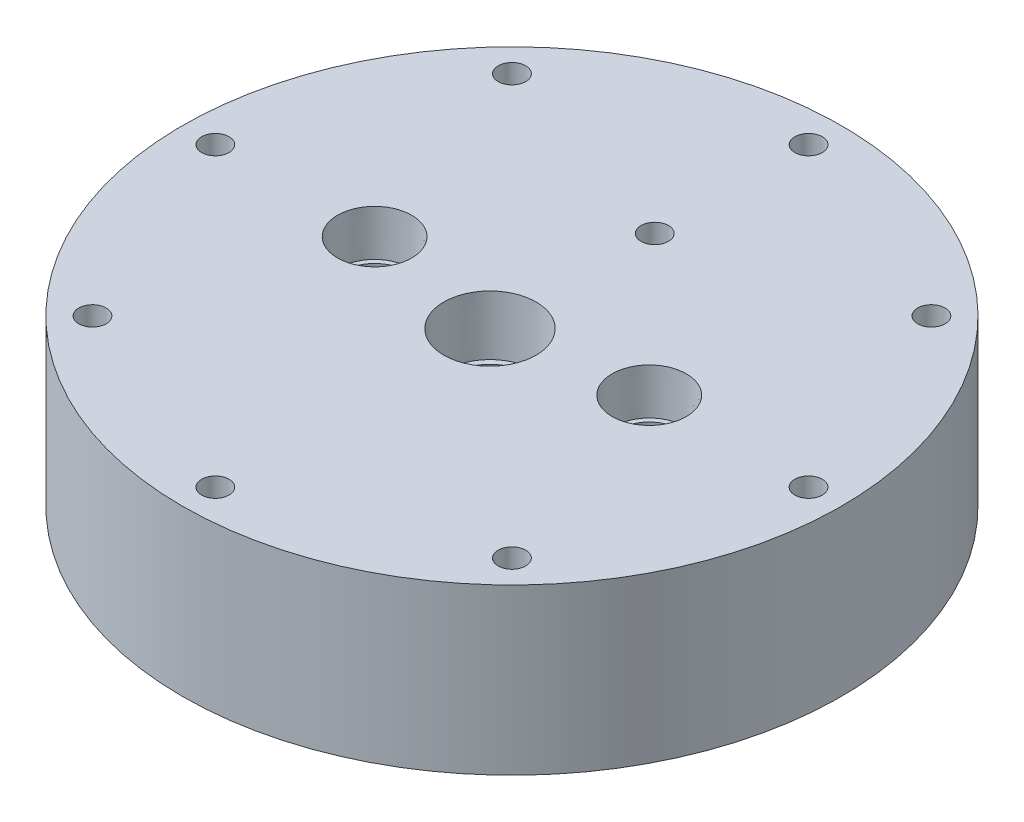
ISO-10303-21;
HEADER;
FILE_DESCRIPTION(('STEP AP214'),'2;1');
FILE_NAME('part.step','',(''),(''),'','','');
FILE_SCHEMA(('AUTOMOTIVE_DESIGN { 1 0 10303 214 1 1 1 1 }'));
ENDSEC;
DATA;
#1=APPLICATION_CONTEXT('core data for automotive mechanical design processes');
#2=APPLICATION_PROTOCOL_DEFINITION('international standard','automotive_design',2000,#1);
#3=PRODUCT_CONTEXT('',#1,'mechanical');
#4=PRODUCT('Part','Part','',(#3));
#5=PRODUCT_RELATED_PRODUCT_CATEGORY('part','',(#4));
#6=PRODUCT_DEFINITION_FORMATION('','',#4);
#7=PRODUCT_DEFINITION_CONTEXT('part definition',#1,'design');
#8=PRODUCT_DEFINITION('design','',#6,#7);
#9=PRODUCT_DEFINITION_SHAPE('','',#8);
#10=(LENGTH_UNIT() NAMED_UNIT(*) SI_UNIT(.MILLI.,.METRE.));
#11=(NAMED_UNIT(*) PLANE_ANGLE_UNIT() SI_UNIT($,.RADIAN.));
#12=(NAMED_UNIT(*) SI_UNIT($,.STERADIAN.) SOLID_ANGLE_UNIT());
#13=UNCERTAINTY_MEASURE_WITH_UNIT(LENGTH_MEASURE(1.E-05),#10,'distance_accuracy_value','');
#14=(GEOMETRIC_REPRESENTATION_CONTEXT(3) GLOBAL_UNCERTAINTY_ASSIGNED_CONTEXT((#13)) GLOBAL_UNIT_ASSIGNED_CONTEXT((#10,
#11,#12)) REPRESENTATION_CONTEXT('',''));
#15=CARTESIAN_POINT('',(0.,0.,0.));
#16=DIRECTION('',(0.,0.,1.));
#17=DIRECTION('',(1.,0.,0.));
#18=AXIS2_PLACEMENT_3D('',#15,#16,#17);
#19=CARTESIAN_POINT('',(0.,-40.64,0.));
#20=DIRECTION('',(0.,1.,0.));
#21=DIRECTION('',(0.,0.,1.));
#22=AXIS2_PLACEMENT_3D('',#19,#20,#21);
#23=PLANE('',#22);
#24=CARTESIAN_POINT('',(0.,-40.64,-33.02));
#25=DIRECTION('',(0.,1.,0.));
#26=DIRECTION('',(0.,0.,1.));
#27=AXIS2_PLACEMENT_3D('',#24,#25,#26);
#28=CIRCLE('',#27,3.175);
#29=CARTESIAN_POINT('',(0.,-40.64,-29.845));
#30=VERTEX_POINT('',#29);
#31=EDGE_CURVE('E564',#30,#30,#28,.F.);
#32=ORIENTED_EDGE('',*,*,#31,.F.);
#33=EDGE_LOOP('',(#32));
#34=FACE_BOUND('',#33,.T.);
#35=CARTESIAN_POINT('',(0.,-40.64,-33.02));
#36=DIRECTION('',(0.,1.,0.));
#37=DIRECTION('',(0.,0.,1.));
#38=AXIS2_PLACEMENT_3D('',#35,#36,#37);
#39=CIRCLE('',#38,7.62);
#40=CARTESIAN_POINT('',(0.,-40.64,-25.4));
#41=VERTEX_POINT('',#40);
#42=EDGE_CURVE('E553',#41,#41,#39,.T.);
#43=ORIENTED_EDGE('',*,*,#42,.F.);
#44=EDGE_LOOP('',(#43));
#45=FACE_BOUND('',#44,.T.);
#46=ADVANCED_FACE('F33',(#34,#45),#23,.F.);
#47=CARTESIAN_POINT('',(0.,-36.83,5.08));
#48=DIRECTION('',(0.,1.,0.));
#49=DIRECTION('',(0.,0.,1.));
#50=AXIS2_PLACEMENT_3D('',#47,#48,#49);
#51=PLANE('',#50);
#52=CARTESIAN_POINT('',(0.,-36.83,5.08));
#53=DIRECTION('',(0.,1.,0.));
#54=DIRECTION('',(0.,0.,1.));
#55=AXIS2_PLACEMENT_3D('',#52,#53,#54);
#56=CIRCLE('',#55,13.97);
#57=CARTESIAN_POINT('',(0.,-36.83,19.05));
#58=VERTEX_POINT('',#57);
#59=EDGE_CURVE('E46',#58,#58,#56,.F.);
#60=ORIENTED_EDGE('',*,*,#59,.F.);
#61=EDGE_LOOP('',(#60));
#62=FACE_BOUND('',#61,.T.);
#63=CARTESIAN_POINT('',(0.,-36.83,5.08));
#64=DIRECTION('',(0.,-1.,0.));
#65=DIRECTION('',(0.,0.,-1.));
#66=AXIS2_PLACEMENT_3D('',#63,#64,#65);
#67=CIRCLE('',#66,16.51);
#68=CARTESIAN_POINT('',(0.,-36.83,-11.43));
#69=VERTEX_POINT('',#68);
#70=EDGE_CURVE('E64',#69,#69,#67,.T.);
#71=ORIENTED_EDGE('',*,*,#70,.T.);
#72=EDGE_LOOP('',(#71));
#73=FACE_BOUND('',#72,.T.);
#74=ADVANCED_FACE('F172',(#62,#73),#51,.F.);
#75=CARTESIAN_POINT('',(0.,-36.83,5.08));
#76=DIRECTION('',(0.,-1.,0.));
#77=DIRECTION('',(0.,0.,-1.));
#78=AXIS2_PLACEMENT_3D('',#75,#76,#77);
#79=CYLINDRICAL_SURFACE('',#78,19.05);
#80=CARTESIAN_POINT('',(0.,-40.64,5.08));
#81=DIRECTION('',(0.,1.,0.));
#82=DIRECTION('',(0.,0.,1.));
#83=AXIS2_PLACEMENT_3D('',#80,#81,#82);
#84=CIRCLE('',#83,19.05);
#85=CARTESIAN_POINT('',(0.,-40.64,24.13));
#86=VERTEX_POINT('',#85);
#87=EDGE_CURVE('E53',#86,#86,#84,.T.);
#88=ORIENTED_EDGE('',*,*,#87,.F.);
#89=EDGE_LOOP('',(#88));
#90=FACE_BOUND('',#89,.T.);
#91=CARTESIAN_POINT('',(0.,-36.83,5.08));
#92=DIRECTION('',(0.,1.,0.));
#93=DIRECTION('',(0.,0.,1.));
#94=AXIS2_PLACEMENT_3D('',#91,#92,#93);
#95=CIRCLE('',#94,19.05);
#96=CARTESIAN_POINT('',(0.,-36.83,24.13));
#97=VERTEX_POINT('',#96);
#98=EDGE_CURVE('E41',#97,#97,#95,.T.);
#99=ORIENTED_EDGE('',*,*,#98,.T.);
#100=EDGE_LOOP('',(#99));
#101=FACE_BOUND('',#100,.T.);
#102=ADVANCED_FACE('F178',(#90,#101),#79,.F.);
#103=CARTESIAN_POINT('',(0.,-36.83,5.08));
#104=DIRECTION('',(0.,-1.,0.));
#105=DIRECTION('',(0.,0.,-1.));
#106=AXIS2_PLACEMENT_3D('',#103,#104,#105);
#107=CIRCLE('',#106,17.78);
#108=CARTESIAN_POINT('',(0.,-36.83,-12.7));
#109=VERTEX_POINT('',#108);
#110=EDGE_CURVE('E82',#109,#109,#107,.T.);
#111=ORIENTED_EDGE('',*,*,#110,.F.);
#112=EDGE_LOOP('',(#111));
#113=FACE_BOUND('',#112,.T.);
#114=ORIENTED_EDGE('',*,*,#98,.F.);
#115=EDGE_LOOP('',(#114));
#116=FACE_BOUND('',#115,.T.);
#117=ADVANCED_FACE('F168',(#113,#116),#51,.F.);
#118=CARTESIAN_POINT('',(0.,-30.48,5.08));
#119=DIRECTION('',(0.,-1.,0.));
#120=DIRECTION('',(0.,0.,-1.));
#121=AXIS2_PLACEMENT_3D('',#118,#119,#120);
#122=CYLINDRICAL_SURFACE('',#121,13.97);
#123=CARTESIAN_POINT('',(0.,-30.48,5.08));
#124=DIRECTION('',(0.,1.,0.));
#125=DIRECTION('',(0.,0.,1.));
#126=AXIS2_PLACEMENT_3D('',#123,#124,#125);
#127=CIRCLE('',#126,13.97);
#128=CARTESIAN_POINT('',(0.,-30.48,19.05));
#129=VERTEX_POINT('',#128);
#130=EDGE_CURVE('E52',#129,#129,#127,.T.);
#131=ORIENTED_EDGE('',*,*,#130,.T.);
#132=EDGE_LOOP('',(#131));
#133=FACE_BOUND('',#132,.T.);
#134=ORIENTED_EDGE('',*,*,#59,.T.);
#135=EDGE_LOOP('',(#134));
#136=FACE_BOUND('',#135,.T.);
#137=ADVANCED_FACE('F153',(#133,#136),#122,.F.);
#138=CARTESIAN_POINT('',(0.,-30.48,5.08));
#139=DIRECTION('',(0.,1.,0.));
#140=DIRECTION('',(0.,0.,1.));
#141=AXIS2_PLACEMENT_3D('',#138,#139,#140);
#142=PLANE('',#141);
#143=CARTESIAN_POINT('',(0.,-30.48,5.08));
#144=DIRECTION('',(0.,1.,0.));
#145=DIRECTION('',(0.,0.,1.));
#146=AXIS2_PLACEMENT_3D('',#143,#144,#145);
#147=CIRCLE('',#146,8.9281);
#148=CARTESIAN_POINT('',(0.,-30.48,14.0081));
#149=VERTEX_POINT('',#148);
#150=EDGE_CURVE('E58',#149,#149,#147,.T.);
#151=ORIENTED_EDGE('',*,*,#150,.T.);
#152=EDGE_LOOP('',(#151));
#153=FACE_BOUND('',#152,.T.);
#154=ORIENTED_EDGE('',*,*,#130,.F.);
#155=EDGE_LOOP('',(#154));
#156=FACE_BOUND('',#155,.T.);
#157=ADVANCED_FACE('F156',(#153,#156),#142,.F.);
#158=CARTESIAN_POINT('',(0.,-40.64,0.));
#159=DIRECTION('',(0.,-1.,0.));
#160=DIRECTION('',(0.,0.,-1.));
#161=AXIS2_PLACEMENT_3D('',#158,#159,#160);
#162=CYLINDRICAL_SURFACE('',#161,60.96);
#163=CARTESIAN_POINT('',(0.,-40.64,0.));
#164=DIRECTION('',(0.,1.,0.));
#165=DIRECTION('',(0.,0.,1.));
#166=AXIS2_PLACEMENT_3D('',#163,#164,#165);
#167=CIRCLE('',#166,60.96);
#168=CARTESIAN_POINT('',(0.,-40.64,60.96));
#169=VERTEX_POINT('',#168);
#170=EDGE_CURVE('E57',#169,#169,#167,.T.);
#171=ORIENTED_EDGE('',*,*,#170,.T.);
#172=EDGE_LOOP('',(#171));
#173=FACE_BOUND('',#172,.T.);
#174=CARTESIAN_POINT('',(0.,-50.8,0.));
#175=DIRECTION('',(0.,1.,0.));
#176=DIRECTION('',(0.,0.,1.));
#177=AXIS2_PLACEMENT_3D('',#174,#175,#176);
#178=CIRCLE('',#177,60.96);
#179=CARTESIAN_POINT('',(0.,-50.8,60.96));
#180=VERTEX_POINT('',#179);
#181=EDGE_CURVE('E60',#180,#180,#178,.T.);
#182=ORIENTED_EDGE('',*,*,#181,.F.);
#183=EDGE_LOOP('',(#182));
#184=FACE_BOUND('',#183,.T.);
#185=ADVANCED_FACE('F158',(#173,#184),#162,.F.);
#186=CARTESIAN_POINT('',(0.,-40.64,-33.02));
#187=DIRECTION('',(0.,1.,0.));
#188=DIRECTION('',(0.,0.,1.));
#189=AXIS2_PLACEMENT_3D('',#186,#187,#188);
#190=CIRCLE('',#189,8.89);
#191=CARTESIAN_POINT('',(0.,-40.64,-24.13));
#192=VERTEX_POINT('',#191);
#193=EDGE_CURVE('E194',#192,#192,#190,.T.);
#194=ORIENTED_EDGE('',*,*,#193,.T.);
#195=EDGE_LOOP('',(#194));
#196=FACE_BOUND('',#195,.T.);
#197=CARTESIAN_POINT('',(-31.75,-40.64,0.));
#198=DIRECTION('',(0.,1.,0.));
#199=DIRECTION('',(0.,0.,1.));
#200=AXIS2_PLACEMENT_3D('',#197,#198,#199);
#201=CIRCLE('',#200,7.1374);
#202=CARTESIAN_POINT('',(-31.75,-40.64,7.1374));
#203=VERTEX_POINT('',#202);
#204=EDGE_CURVE('E37',#203,#203,#201,.T.);
#205=ORIENTED_EDGE('',*,*,#204,.T.);
#206=EDGE_LOOP('',(#205));
#207=FACE_BOUND('',#206,.T.);
#208=CARTESIAN_POINT('',(31.75,-40.64,0.));
#209=DIRECTION('',(0.,1.,0.));
#210=DIRECTION('',(0.,0.,1.));
#211=AXIS2_PLACEMENT_3D('',#208,#209,#210);
#212=CIRCLE('',#211,7.1374);
#213=CARTESIAN_POINT('',(31.75,-40.64,7.1374));
#214=VERTEX_POINT('',#213);
#215=EDGE_CURVE('E62',#214,#214,#212,.T.);
#216=ORIENTED_EDGE('',*,*,#215,.T.);
#217=EDGE_LOOP('',(#216));
#218=FACE_BOUND('',#217,.T.);
#219=ORIENTED_EDGE('',*,*,#87,.T.);
#220=EDGE_LOOP('',(#219));
#221=FACE_BOUND('',#220,.T.);
#222=ORIENTED_EDGE('',*,*,#170,.F.);
#223=EDGE_LOOP('',(#222));
#224=FACE_BOUND('',#223,.T.);
#225=ADVANCED_FACE('F165',(#196,#207,#218,#221,#224),#23,.F.);
#226=CARTESIAN_POINT('',(0.,-12.7,0.));
#227=DIRECTION('',(0.,1.,0.));
#228=DIRECTION('',(0.,0.,1.));
#229=AXIS2_PLACEMENT_3D('',#226,#227,#228);
#230=PLANE('',#229);
#231=CARTESIAN_POINT('',(0.,-12.7,-33.02));
#232=DIRECTION('',(0.,1.,0.));
#233=DIRECTION('',(0.,0.,1.));
#234=AXIS2_PLACEMENT_3D('',#231,#232,#233);
#235=CIRCLE('',#234,3.175);
#236=CARTESIAN_POINT('',(0.,-12.7,-29.845));
#237=VERTEX_POINT('',#236);
#238=EDGE_CURVE('E560',#237,#237,#235,.F.);
#239=ORIENTED_EDGE('',*,*,#238,.T.);
#240=EDGE_LOOP('',(#239));
#241=FACE_BOUND('',#240,.T.);
#242=CARTESIAN_POINT('',(-31.75,-12.7,0.));
#243=DIRECTION('',(0.,1.,0.));
#244=DIRECTION('',(0.,0.,1.));
#245=AXIS2_PLACEMENT_3D('',#242,#243,#244);
#246=CIRCLE('',#245,8.5750146);
#247=CARTESIAN_POINT('',(-31.75,-12.7,8.5750146));
#248=VERTEX_POINT('',#247);
#249=EDGE_CURVE('E567',#248,#248,#246,.T.);
#250=ORIENTED_EDGE('',*,*,#249,.F.);
#251=EDGE_LOOP('',(#250));
#252=FACE_BOUND('',#251,.T.);
#253=CARTESIAN_POINT('',(31.75,-12.7,0.));
#254=DIRECTION('',(0.,1.,0.));
#255=DIRECTION('',(0.,0.,1.));
#256=AXIS2_PLACEMENT_3D('',#253,#254,#255);
#257=CIRCLE('',#256,8.5750146);
#258=CARTESIAN_POINT('',(31.75,-12.7,8.5750146));
#259=VERTEX_POINT('',#258);
#260=EDGE_CURVE('E77',#259,#259,#257,.T.);
#261=ORIENTED_EDGE('',*,*,#260,.F.);
#262=EDGE_LOOP('',(#261));
#263=FACE_BOUND('',#262,.T.);
#264=CARTESIAN_POINT('',(0.,-12.7,5.08));
#265=DIRECTION('',(0.,1.,0.));
#266=DIRECTION('',(0.,0.,1.));
#267=AXIS2_PLACEMENT_3D('',#264,#265,#266);
#268=CIRCLE('',#267,10.6647361);
#269=CARTESIAN_POINT('',(0.,-12.7,15.7447361));
#270=VERTEX_POINT('',#269);
#271=EDGE_CURVE('E87',#270,#270,#268,.T.);
#272=ORIENTED_EDGE('',*,*,#271,.F.);
#273=EDGE_LOOP('',(#272));
#274=FACE_BOUND('',#273,.T.);
#275=CARTESIAN_POINT('',(68.58,-12.7,2.41126874597481E-13));
#276=DIRECTION('',(0.,1.,0.));
#277=DIRECTION('',(0.,0.,1.));
#278=AXIS2_PLACEMENT_3D('',#275,#276,#277);
#279=CIRCLE('',#278,3.175);
#280=CARTESIAN_POINT('',(68.58,-12.7,3.17500000000024));
#281=VERTEX_POINT('',#280);
#282=EDGE_CURVE('E116',#281,#281,#279,.T.);
#283=ORIENTED_EDGE('',*,*,#282,.F.);
#284=EDGE_LOOP('',(#283));
#285=FACE_BOUND('',#284,.T.);
#286=CARTESIAN_POINT('',(48.4933830537732,-12.7,48.4933830537737));
#287=DIRECTION('',(0.,1.,0.));
#288=DIRECTION('',(0.,0.,1.));
#289=AXIS2_PLACEMENT_3D('',#286,#287,#288);
#290=CIRCLE('',#289,3.175);
#291=CARTESIAN_POINT('',(48.4933830537732,-12.7,51.6683830537737));
#292=VERTEX_POINT('',#291);
#293=EDGE_CURVE('E117',#292,#292,#290,.T.);
#294=ORIENTED_EDGE('',*,*,#293,.F.);
#295=EDGE_LOOP('',(#294));
#296=FACE_BOUND('',#295,.T.);
#297=CARTESIAN_POINT('',(0.,-12.7,68.58));
#298=DIRECTION('',(0.,1.,0.));
#299=DIRECTION('',(0.,0.,1.));
#300=AXIS2_PLACEMENT_3D('',#297,#298,#299);
#301=CIRCLE('',#300,3.175);
#302=CARTESIAN_POINT('',(0.,-12.7,71.755));
#303=VERTEX_POINT('',#302);
#304=EDGE_CURVE('E124',#303,#303,#301,.T.);
#305=ORIENTED_EDGE('',*,*,#304,.F.);
#306=EDGE_LOOP('',(#305));
#307=FACE_BOUND('',#306,.T.);
#308=CARTESIAN_POINT('',(-48.4933830537739,-12.7,48.493383053773));
#309=DIRECTION('',(0.,1.,0.));
#310=DIRECTION('',(0.,0.,1.));
#311=AXIS2_PLACEMENT_3D('',#308,#309,#310);
#312=CIRCLE('',#311,3.175);
#313=CARTESIAN_POINT('',(-48.4933830537739,-12.7,51.668383053773));
#314=VERTEX_POINT('',#313);
#315=EDGE_CURVE('E130',#314,#314,#312,.T.);
#316=ORIENTED_EDGE('',*,*,#315,.F.);
#317=EDGE_LOOP('',(#316));
#318=FACE_BOUND('',#317,.T.);
#319=CARTESIAN_POINT('',(-68.58,-12.7,-7.20018455033205E-13));
#320=DIRECTION('',(0.,1.,0.));
#321=DIRECTION('',(0.,0.,1.));
#322=AXIS2_PLACEMENT_3D('',#319,#320,#321);
#323=CIRCLE('',#322,3.175);
#324=CARTESIAN_POINT('',(-68.58,-12.7,3.17499999999928));
#325=VERTEX_POINT('',#324);
#326=EDGE_CURVE('E104',#325,#325,#323,.T.);
#327=ORIENTED_EDGE('',*,*,#326,.F.);
#328=EDGE_LOOP('',(#327));
#329=FACE_BOUND('',#328,.T.);
#330=CARTESIAN_POINT('',(-48.4933830537728,-12.7,-48.493383053774));
#331=DIRECTION('',(0.,1.,0.));
#332=DIRECTION('',(0.,0.,1.));
#333=AXIS2_PLACEMENT_3D('',#330,#331,#332);
#334=CIRCLE('',#333,3.175);
#335=CARTESIAN_POINT('',(-48.4933830537728,-12.7,-45.318383053774));
#336=VERTEX_POINT('',#335);
#337=EDGE_CURVE('E105',#336,#336,#334,.T.);
#338=ORIENTED_EDGE('',*,*,#337,.F.);
#339=EDGE_LOOP('',(#338));
#340=FACE_BOUND('',#339,.T.);
#341=CARTESIAN_POINT('',(48.4933830537735,-12.7,-48.4933830537733));
#342=DIRECTION('',(0.,1.,0.));
#343=DIRECTION('',(0.,0.,1.));
#344=AXIS2_PLACEMENT_3D('',#341,#342,#343);
#345=CIRCLE('',#344,3.175);
#346=CARTESIAN_POINT('',(48.4933830537735,-12.7,-45.3183830537734));
#347=VERTEX_POINT('',#346);
#348=EDGE_CURVE('E139',#347,#347,#345,.T.);
#349=ORIENTED_EDGE('',*,*,#348,.F.);
#350=EDGE_LOOP('',(#349));
#351=FACE_BOUND('',#350,.T.);
#352=CARTESIAN_POINT('',(0.,-12.7,-68.58));
#353=DIRECTION('',(0.,1.,0.));
#354=DIRECTION('',(0.,0.,1.));
#355=AXIS2_PLACEMENT_3D('',#352,#353,#354);
#356=CIRCLE('',#355,3.175);
#357=CARTESIAN_POINT('',(0.,-12.7,-65.405));
#358=VERTEX_POINT('',#357);
#359=EDGE_CURVE('E145',#358,#358,#356,.T.);
#360=ORIENTED_EDGE('',*,*,#359,.F.);
#361=EDGE_LOOP('',(#360));
#362=FACE_BOUND('',#361,.T.);
#363=CARTESIAN_POINT('',(0.,-12.7,0.));
#364=DIRECTION('',(0.,1.,0.));
#365=DIRECTION('',(0.,0.,1.));
#366=AXIS2_PLACEMENT_3D('',#363,#364,#365);
#367=CIRCLE('',#366,76.2);
#368=CARTESIAN_POINT('',(0.,-12.7,76.2));
#369=VERTEX_POINT('',#368);
#370=EDGE_CURVE('E148',#369,#369,#367,.T.);
#371=ORIENTED_EDGE('',*,*,#370,.T.);
#372=EDGE_LOOP('',(#371));
#373=FACE_BOUND('',#372,.T.);
#374=ADVANCED_FACE('F185',(#241,#252,#263,#274,#285,#296,#307,#318,#329,#340,#351,#362,#373),
#230,.T.);
#375=CARTESIAN_POINT('',(0.,-50.8,0.));
#376=DIRECTION('',(0.,1.,0.));
#377=DIRECTION('',(0.,0.,1.));
#378=AXIS2_PLACEMENT_3D('',#375,#376,#377);
#379=CYLINDRICAL_SURFACE('',#378,76.2);
#380=CARTESIAN_POINT('',(0.,-50.8,0.));
#381=DIRECTION('',(0.,1.,0.));
#382=DIRECTION('',(0.,0.,1.));
#383=AXIS2_PLACEMENT_3D('',#380,#381,#382);
#384=CIRCLE('',#383,76.2);
#385=CARTESIAN_POINT('',(0.,-50.8,76.2));
#386=VERTEX_POINT('',#385);
#387=EDGE_CURVE('E10',#386,#386,#384,.T.);
#388=ORIENTED_EDGE('',*,*,#387,.T.);
#389=EDGE_LOOP('',(#388));
#390=FACE_BOUND('',#389,.T.);
#391=ORIENTED_EDGE('',*,*,#370,.F.);
#392=EDGE_LOOP('',(#391));
#393=FACE_BOUND('',#392,.T.);
#394=ADVANCED_FACE('F35',(#390,#393),#379,.T.);
#395=CARTESIAN_POINT('',(0.,-12.699,-68.58));
#396=DIRECTION('',(0.,-1.,0.));
#397=DIRECTION('',(0.,0.,-1.));
#398=AXIS2_PLACEMENT_3D('',#395,#396,#397);
#399=CYLINDRICAL_SURFACE('',#398,3.175);
#400=ORIENTED_EDGE('',*,*,#359,.T.);
#401=EDGE_LOOP('',(#400));
#402=FACE_BOUND('',#401,.T.);
#403=CARTESIAN_POINT('',(0.,-50.8,-68.58));
#404=DIRECTION('',(0.,1.,0.));
#405=DIRECTION('',(0.,0.,1.));
#406=AXIS2_PLACEMENT_3D('',#403,#404,#405);
#407=CIRCLE('',#406,3.175);
#408=CARTESIAN_POINT('',(0.,-50.8,-65.405));
#409=VERTEX_POINT('',#408);
#410=EDGE_CURVE('E142',#409,#409,#407,.T.);
#411=ORIENTED_EDGE('',*,*,#410,.F.);
#412=EDGE_LOOP('',(#411));
#413=FACE_BOUND('',#412,.T.);
#414=ADVANCED_FACE('F226',(#402,#413),#399,.F.);
#415=CARTESIAN_POINT('',(48.4933830537735,-12.699,-48.4933830537733));
#416=DIRECTION('',(0.,-1.,0.));
#417=DIRECTION('',(0.,0.,-1.));
#418=AXIS2_PLACEMENT_3D('',#415,#416,#417);
#419=CYLINDRICAL_SURFACE('',#418,3.175);
#420=ORIENTED_EDGE('',*,*,#348,.T.);
#421=EDGE_LOOP('',(#420));
#422=FACE_BOUND('',#421,.T.);
#423=CARTESIAN_POINT('',(48.4933830537735,-50.8,-48.4933830537733));
#424=DIRECTION('',(0.,1.,0.));
#425=DIRECTION('',(-0.707106781186549,0.,0.707106781186546));
#426=AXIS2_PLACEMENT_3D('',#423,#424,#425);
#427=CIRCLE('',#426,3.175);
#428=CARTESIAN_POINT('',(46.2483190235062,-50.8,-46.2483190235061));
#429=VERTEX_POINT('',#428);
#430=EDGE_CURVE('E120',#429,#429,#427,.T.);
#431=ORIENTED_EDGE('',*,*,#430,.F.);
#432=EDGE_LOOP('',(#431));
#433=FACE_BOUND('',#432,.T.);
#434=ADVANCED_FACE('F228',(#422,#433),#419,.F.);
#435=CARTESIAN_POINT('',(-48.4933830537728,-12.699,-48.493383053774));
#436=DIRECTION('',(0.,-1.,0.));
#437=DIRECTION('',(0.,0.,-1.));
#438=AXIS2_PLACEMENT_3D('',#435,#436,#437);
#439=CYLINDRICAL_SURFACE('',#438,3.175);
#440=ORIENTED_EDGE('',*,*,#337,.T.);
#441=EDGE_LOOP('',(#440));
#442=FACE_BOUND('',#441,.T.);
#443=CARTESIAN_POINT('',(-48.4933830537728,-50.8,-48.493383053774));
#444=DIRECTION('',(0.,1.,0.));
#445=DIRECTION('',(0.707106781186539,0.,0.707106781186556));
#446=AXIS2_PLACEMENT_3D('',#443,#444,#445);
#447=CIRCLE('',#446,3.175);
#448=CARTESIAN_POINT('',(-46.2483190235056,-50.8,-46.2483190235067));
#449=VERTEX_POINT('',#448);
#450=EDGE_CURVE('E56',#449,#449,#447,.T.);
#451=ORIENTED_EDGE('',*,*,#450,.F.);
#452=EDGE_LOOP('',(#451));
#453=FACE_BOUND('',#452,.T.);
#454=ADVANCED_FACE('F235',(#442,#453),#439,.F.);
#455=CARTESIAN_POINT('',(-68.58,-12.699,-7.20018455033205E-13));
#456=DIRECTION('',(0.,-1.,0.));
#457=DIRECTION('',(0.,0.,-1.));
#458=AXIS2_PLACEMENT_3D('',#455,#456,#457);
#459=CYLINDRICAL_SURFACE('',#458,3.175);
#460=ORIENTED_EDGE('',*,*,#326,.T.);
#461=EDGE_LOOP('',(#460));
#462=FACE_BOUND('',#461,.T.);
#463=CARTESIAN_POINT('',(-68.58,-50.8,-7.20018455033205E-13));
#464=DIRECTION('',(0.,1.,0.));
#465=DIRECTION('',(1.,0.,0.));
#466=AXIS2_PLACEMENT_3D('',#463,#464,#465);
#467=CIRCLE('',#466,3.175);
#468=CARTESIAN_POINT('',(-65.405,-50.8,-6.86762095280724E-13));
#469=VERTEX_POINT('',#468);
#470=EDGE_CURVE('E101',#469,#469,#467,.T.);
#471=ORIENTED_EDGE('',*,*,#470,.F.);
#472=EDGE_LOOP('',(#471));
#473=FACE_BOUND('',#472,.T.);
#474=ADVANCED_FACE('F243',(#462,#473),#459,.F.);
#475=CARTESIAN_POINT('',(-48.4933830537739,-12.699,48.493383053773));
#476=DIRECTION('',(0.,-1.,0.));
#477=DIRECTION('',(0.,0.,-1.));
#478=AXIS2_PLACEMENT_3D('',#475,#476,#477);
#479=CYLINDRICAL_SURFACE('',#478,3.175);
#480=ORIENTED_EDGE('',*,*,#315,.T.);
#481=EDGE_LOOP('',(#480));
#482=FACE_BOUND('',#481,.T.);
#483=CARTESIAN_POINT('',(-48.4933830537739,-50.8,48.493383053773));
#484=DIRECTION('',(0.,1.,0.));
#485=DIRECTION('',(0.707106781186554,0.,-0.707106781186541));
#486=AXIS2_PLACEMENT_3D('',#483,#484,#485);
#487=CIRCLE('',#486,3.175);
#488=CARTESIAN_POINT('',(-46.2483190235065,-50.8,46.2483190235057));
#489=VERTEX_POINT('',#488);
#490=EDGE_CURVE('E108',#489,#489,#487,.T.);
#491=ORIENTED_EDGE('',*,*,#490,.F.);
#492=EDGE_LOOP('',(#491));
#493=FACE_BOUND('',#492,.T.);
#494=ADVANCED_FACE('F239',(#482,#493),#479,.F.);
#495=CARTESIAN_POINT('',(0.,-12.699,68.58));
#496=DIRECTION('',(0.,-1.,0.));
#497=DIRECTION('',(0.,0.,-1.));
#498=AXIS2_PLACEMENT_3D('',#495,#496,#497);
#499=CYLINDRICAL_SURFACE('',#498,3.175);
#500=ORIENTED_EDGE('',*,*,#304,.T.);
#501=EDGE_LOOP('',(#500));
#502=FACE_BOUND('',#501,.T.);
#503=CARTESIAN_POINT('',(0.,-50.8,68.58));
#504=DIRECTION('',(0.,1.,0.));
#505=DIRECTION('',(0.,0.,-1.));
#506=AXIS2_PLACEMENT_3D('',#503,#504,#505);
#507=CIRCLE('',#506,3.175);
#508=CARTESIAN_POINT('',(0.,-50.8,65.405));
#509=VERTEX_POINT('',#508);
#510=EDGE_CURVE('E127',#509,#509,#507,.T.);
#511=ORIENTED_EDGE('',*,*,#510,.F.);
#512=EDGE_LOOP('',(#511));
#513=FACE_BOUND('',#512,.T.);
#514=ADVANCED_FACE('F242',(#502,#513),#499,.F.);
#515=CARTESIAN_POINT('',(48.4933830537732,-12.699,48.4933830537737));
#516=DIRECTION('',(0.,-1.,0.));
#517=DIRECTION('',(0.,0.,-1.));
#518=AXIS2_PLACEMENT_3D('',#515,#516,#517);
#519=CYLINDRICAL_SURFACE('',#518,3.175);
#520=ORIENTED_EDGE('',*,*,#293,.T.);
#521=EDGE_LOOP('',(#520));
#522=FACE_BOUND('',#521,.T.);
#523=CARTESIAN_POINT('',(48.4933830537732,-50.8,48.4933830537737));
#524=DIRECTION('',(0.,1.,0.));
#525=DIRECTION('',(-0.707106781186544,0.,-0.707106781186551));
#526=AXIS2_PLACEMENT_3D('',#523,#524,#525);
#527=CIRCLE('',#526,3.175);
#528=CARTESIAN_POINT('',(46.2483190235059,-50.8,46.2483190235064));
#529=VERTEX_POINT('',#528);
#530=EDGE_CURVE('E121',#529,#529,#527,.T.);
#531=ORIENTED_EDGE('',*,*,#530,.F.);
#532=EDGE_LOOP('',(#531));
#533=FACE_BOUND('',#532,.T.);
#534=ADVANCED_FACE('F247',(#522,#533),#519,.F.);
#535=CARTESIAN_POINT('',(68.58,-12.699,2.41126874597481E-13));
#536=DIRECTION('',(0.,-1.,0.));
#537=DIRECTION('',(0.,0.,-1.));
#538=AXIS2_PLACEMENT_3D('',#535,#536,#537);
#539=CYLINDRICAL_SURFACE('',#538,3.175);
#540=ORIENTED_EDGE('',*,*,#282,.T.);
#541=EDGE_LOOP('',(#540));
#542=FACE_BOUND('',#541,.T.);
#543=CARTESIAN_POINT('',(68.58,-50.8,2.41126874597481E-13));
#544=DIRECTION('',(0.,1.,0.));
#545=DIRECTION('',(-1.,0.,0.));
#546=AXIS2_PLACEMENT_3D('',#543,#544,#545);
#547=CIRCLE('',#546,3.175);
#548=CARTESIAN_POINT('',(65.405,-50.8,2.30041421346654E-13));
#549=VERTEX_POINT('',#548);
#550=EDGE_CURVE('E113',#549,#549,#547,.T.);
#551=ORIENTED_EDGE('',*,*,#550,.F.);
#552=EDGE_LOOP('',(#551));
#553=FACE_BOUND('',#552,.T.);
#554=ADVANCED_FACE('F208',(#542,#553),#539,.F.);
#555=CARTESIAN_POINT('',(0.,-50.8,0.));
#556=DIRECTION('',(0.,1.,0.));
#557=DIRECTION('',(0.,0.,1.));
#558=AXIS2_PLACEMENT_3D('',#555,#556,#557);
#559=PLANE('',#558);
#560=ORIENTED_EDGE('',*,*,#181,.T.);
#561=EDGE_LOOP('',(#560));
#562=FACE_BOUND('',#561,.T.);
#563=ORIENTED_EDGE('',*,*,#550,.T.);
#564=EDGE_LOOP('',(#563));
#565=FACE_BOUND('',#564,.T.);
#566=ORIENTED_EDGE('',*,*,#530,.T.);
#567=EDGE_LOOP('',(#566));
#568=FACE_BOUND('',#567,.T.);
#569=ORIENTED_EDGE('',*,*,#510,.T.);
#570=EDGE_LOOP('',(#569));
#571=FACE_BOUND('',#570,.T.);
#572=ORIENTED_EDGE('',*,*,#490,.T.);
#573=EDGE_LOOP('',(#572));
#574=FACE_BOUND('',#573,.T.);
#575=ORIENTED_EDGE('',*,*,#470,.T.);
#576=EDGE_LOOP('',(#575));
#577=FACE_BOUND('',#576,.T.);
#578=ORIENTED_EDGE('',*,*,#450,.T.);
#579=EDGE_LOOP('',(#578));
#580=FACE_BOUND('',#579,.T.);
#581=ORIENTED_EDGE('',*,*,#430,.T.);
#582=EDGE_LOOP('',(#581));
#583=FACE_BOUND('',#582,.T.);
#584=ORIENTED_EDGE('',*,*,#410,.T.);
#585=EDGE_LOOP('',(#584));
#586=FACE_BOUND('',#585,.T.);
#587=ORIENTED_EDGE('',*,*,#387,.F.);
#588=EDGE_LOOP('',(#587));
#589=FACE_BOUND('',#588,.T.);
#590=ADVANCED_FACE('F204',(#562,#565,#568,#571,#574,#577,#580,#583,#586,#589),#559,.F.);
#591=CARTESIAN_POINT('',(0.,-12.7,5.08));
#592=DIRECTION('',(0.,1.,0.));
#593=DIRECTION('',(0.,0.,1.));
#594=AXIS2_PLACEMENT_3D('',#591,#592,#593);
#595=CYLINDRICAL_SURFACE('',#594,8.9281);
#596=CARTESIAN_POINT('',(0.,-26.162,5.08));
#597=DIRECTION('',(0.,1.,0.));
#598=DIRECTION('',(0.,0.,1.));
#599=AXIS2_PLACEMENT_3D('',#596,#597,#598);
#600=CIRCLE('',#599,8.9281);
#601=CARTESIAN_POINT('',(0.,-26.162,14.0081));
#602=VERTEX_POINT('',#601);
#603=EDGE_CURVE('E61',#602,#602,#600,.T.);
#604=ORIENTED_EDGE('',*,*,#603,.T.);
#605=EDGE_LOOP('',(#604));
#606=FACE_BOUND('',#605,.T.);
#607=ORIENTED_EDGE('',*,*,#150,.F.);
#608=EDGE_LOOP('',(#607));
#609=FACE_BOUND('',#608,.T.);
#610=ADVANCED_FACE('F207',(#606,#609),#595,.F.);
#611=CARTESIAN_POINT('',(8.9281,-26.162,5.08));
#612=DIRECTION('',(0.,-1.,0.));
#613=DIRECTION('',(0.,0.,-1.));
#614=AXIS2_PLACEMENT_3D('',#611,#612,#613);
#615=PLANE('',#614);
#616=ORIENTED_EDGE('',*,*,#603,.F.);
#617=EDGE_LOOP('',(#616));
#618=FACE_BOUND('',#617,.T.);
#619=CARTESIAN_POINT('',(0.,-26.162,5.08));
#620=DIRECTION('',(0.,1.,0.));
#621=DIRECTION('',(0.,0.,1.));
#622=AXIS2_PLACEMENT_3D('',#619,#620,#621);
#623=CIRCLE('',#622,10.2616657920863);
#624=CARTESIAN_POINT('',(0.,-26.162,15.3416657920863));
#625=VERTEX_POINT('',#624);
#626=EDGE_CURVE('E92',#625,#625,#623,.T.);
#627=ORIENTED_EDGE('',*,*,#626,.T.);
#628=EDGE_LOOP('',(#627));
#629=FACE_BOUND('',#628,.T.);
#630=ADVANCED_FACE('F306',(#618,#629),#615,.F.);
#631=CARTESIAN_POINT('',(0.,-12.7,5.08));
#632=DIRECTION('',(0.,1.,0.));
#633=DIRECTION('',(0.,0.,1.));
#634=AXIS2_PLACEMENT_3D('',#631,#632,#633);
#635=CONICAL_SURFACE('',#634,10.6647361,0.0299323966717032);
#636=ORIENTED_EDGE('',*,*,#626,.F.);
#637=EDGE_LOOP('',(#636));
#638=FACE_BOUND('',#637,.T.);
#639=ORIENTED_EDGE('',*,*,#271,.T.);
#640=EDGE_LOOP('',(#639));
#641=FACE_BOUND('',#640,.T.);
#642=ADVANCED_FACE('F313',(#638,#641),#635,.F.);
#643=CARTESIAN_POINT('',(0.,-35.56,5.08));
#644=DIRECTION('',(0.,-1.,0.));
#645=DIRECTION('',(0.,0.,-1.));
#646=AXIS2_PLACEMENT_3D('',#643,#644,#645);
#647=CYLINDRICAL_SURFACE('',#646,17.78);
#648=CARTESIAN_POINT('',(0.,-35.56,5.08));
#649=DIRECTION('',(0.,-1.,0.));
#650=DIRECTION('',(0.,0.,-1.));
#651=AXIS2_PLACEMENT_3D('',#648,#649,#650);
#652=CIRCLE('',#651,17.78);
#653=CARTESIAN_POINT('',(0.,-35.56,-12.7));
#654=VERTEX_POINT('',#653);
#655=EDGE_CURVE('E84',#654,#654,#652,.T.);
#656=ORIENTED_EDGE('',*,*,#655,.F.);
#657=EDGE_LOOP('',(#656));
#658=FACE_BOUND('',#657,.T.);
#659=ORIENTED_EDGE('',*,*,#110,.T.);
#660=EDGE_LOOP('',(#659));
#661=FACE_BOUND('',#660,.T.);
#662=ADVANCED_FACE('F321',(#658,#661),#647,.F.);
#663=CARTESIAN_POINT('',(0.,-35.56,5.08));
#664=DIRECTION('',(0.,-1.,0.));
#665=DIRECTION('',(0.,0.,-1.));
#666=AXIS2_PLACEMENT_3D('',#663,#664,#665);
#667=PLANE('',#666);
#668=CARTESIAN_POINT('',(0.,-35.56,5.08));
#669=DIRECTION('',(0.,-1.,0.));
#670=DIRECTION('',(0.,0.,-1.));
#671=AXIS2_PLACEMENT_3D('',#668,#669,#670);
#672=CIRCLE('',#671,16.51);
#673=CARTESIAN_POINT('',(0.,-35.56,-11.43));
#674=VERTEX_POINT('',#673);
#675=EDGE_CURVE('E69',#674,#674,#672,.T.);
#676=ORIENTED_EDGE('',*,*,#675,.F.);
#677=EDGE_LOOP('',(#676));
#678=FACE_BOUND('',#677,.T.);
#679=ORIENTED_EDGE('',*,*,#655,.T.);
#680=EDGE_LOOP('',(#679));
#681=FACE_BOUND('',#680,.T.);
#682=ADVANCED_FACE('F330',(#678,#681),#667,.T.);
#683=CARTESIAN_POINT('',(0.,-35.56,5.08));
#684=DIRECTION('',(0.,-1.,0.));
#685=DIRECTION('',(0.,0.,-1.));
#686=AXIS2_PLACEMENT_3D('',#683,#684,#685);
#687=CYLINDRICAL_SURFACE('',#686,16.51);
#688=ORIENTED_EDGE('',*,*,#675,.T.);
#689=EDGE_LOOP('',(#688));
#690=FACE_BOUND('',#689,.T.);
#691=ORIENTED_EDGE('',*,*,#70,.F.);
#692=EDGE_LOOP('',(#691));
#693=FACE_BOUND('',#692,.T.);
#694=ADVANCED_FACE('F339',(#690,#693),#687,.T.);
#695=CARTESIAN_POINT('',(31.75,-12.7,0.));
#696=DIRECTION('',(0.,1.,0.));
#697=DIRECTION('',(0.,0.,1.));
#698=AXIS2_PLACEMENT_3D('',#695,#696,#697);
#699=CYLINDRICAL_SURFACE('',#698,7.1374);
#700=CARTESIAN_POINT('',(31.75,-23.114,0.));
#701=DIRECTION('',(0.,1.,0.));
#702=DIRECTION('',(0.,0.,1.));
#703=AXIS2_PLACEMENT_3D('',#700,#701,#702);
#704=CIRCLE('',#703,7.1374);
#705=CARTESIAN_POINT('',(31.75,-23.114,7.1374));
#706=VERTEX_POINT('',#705);
#707=EDGE_CURVE('E65',#706,#706,#704,.T.);
#708=ORIENTED_EDGE('',*,*,#707,.T.);
#709=EDGE_LOOP('',(#708));
#710=FACE_BOUND('',#709,.T.);
#711=ORIENTED_EDGE('',*,*,#215,.F.);
#712=EDGE_LOOP('',(#711));
#713=FACE_BOUND('',#712,.T.);
#714=ADVANCED_FACE('F347',(#710,#713),#699,.F.);
#715=CARTESIAN_POINT('',(38.8874,-23.114,0.));
#716=DIRECTION('',(0.,-1.,0.));
#717=DIRECTION('',(0.,0.,-1.));
#718=AXIS2_PLACEMENT_3D('',#715,#716,#717);
#719=PLANE('',#718);
#720=ORIENTED_EDGE('',*,*,#707,.F.);
#721=EDGE_LOOP('',(#720));
#722=FACE_BOUND('',#721,.T.);
#723=CARTESIAN_POINT('',(31.75,-23.114,0.));
#724=DIRECTION('',(0.,1.,0.));
#725=DIRECTION('',(0.,0.,1.));
#726=AXIS2_PLACEMENT_3D('',#723,#724,#725);
#727=CIRCLE('',#726,8.26320549387809);
#728=CARTESIAN_POINT('',(31.75,-23.114,8.26320549387809));
#729=VERTEX_POINT('',#728);
#730=EDGE_CURVE('E72',#729,#729,#727,.T.);
#731=ORIENTED_EDGE('',*,*,#730,.T.);
#732=EDGE_LOOP('',(#731));
#733=FACE_BOUND('',#732,.T.);
#734=ADVANCED_FACE('F355',(#722,#733),#719,.F.);
#735=CARTESIAN_POINT('',(31.75,-12.7,0.));
#736=DIRECTION('',(0.,1.,0.));
#737=DIRECTION('',(0.,0.,1.));
#738=AXIS2_PLACEMENT_3D('',#735,#736,#737);
#739=CONICAL_SURFACE('',#738,8.5750146,0.0299323966717029);
#740=ORIENTED_EDGE('',*,*,#730,.F.);
#741=EDGE_LOOP('',(#740));
#742=FACE_BOUND('',#741,.T.);
#743=ORIENTED_EDGE('',*,*,#260,.T.);
#744=EDGE_LOOP('',(#743));
#745=FACE_BOUND('',#744,.T.);
#746=ADVANCED_FACE('F362',(#742,#745),#739,.F.);
#747=CARTESIAN_POINT('',(-31.75,-12.7,0.));
#748=DIRECTION('',(0.,1.,0.));
#749=DIRECTION('',(0.,0.,1.));
#750=AXIS2_PLACEMENT_3D('',#747,#748,#749);
#751=CYLINDRICAL_SURFACE('',#750,7.1374);
#752=CARTESIAN_POINT('',(-31.75,-23.114,0.));
#753=DIRECTION('',(0.,1.,0.));
#754=DIRECTION('',(0.,0.,1.));
#755=AXIS2_PLACEMENT_3D('',#752,#753,#754);
#756=CIRCLE('',#755,7.1374);
#757=CARTESIAN_POINT('',(-31.75,-23.114,7.1374));
#758=VERTEX_POINT('',#757);
#759=EDGE_CURVE('E573',#758,#758,#756,.T.);
#760=ORIENTED_EDGE('',*,*,#759,.T.);
#761=EDGE_LOOP('',(#760));
#762=FACE_BOUND('',#761,.T.);
#763=ORIENTED_EDGE('',*,*,#204,.F.);
#764=EDGE_LOOP('',(#763));
#765=FACE_BOUND('',#764,.T.);
#766=ADVANCED_FACE('F370',(#762,#765),#751,.F.);
#767=CARTESIAN_POINT('',(-24.6126,-23.114,0.));
#768=DIRECTION('',(0.,-1.,0.));
#769=DIRECTION('',(0.,0.,-1.));
#770=AXIS2_PLACEMENT_3D('',#767,#768,#769);
#771=PLANE('',#770);
#772=ORIENTED_EDGE('',*,*,#759,.F.);
#773=EDGE_LOOP('',(#772));
#774=FACE_BOUND('',#773,.T.);
#775=CARTESIAN_POINT('',(-31.75,-23.114,0.));
#776=DIRECTION('',(0.,1.,0.));
#777=DIRECTION('',(0.,0.,1.));
#778=AXIS2_PLACEMENT_3D('',#775,#776,#777);
#779=CIRCLE('',#778,8.26320549387809);
#780=CARTESIAN_POINT('',(-31.75,-23.114,8.26320549387809));
#781=VERTEX_POINT('',#780);
#782=EDGE_CURVE('E570',#781,#781,#779,.T.);
#783=ORIENTED_EDGE('',*,*,#782,.T.);
#784=EDGE_LOOP('',(#783));
#785=FACE_BOUND('',#784,.T.);
#786=ADVANCED_FACE('F378',(#774,#785),#771,.F.);
#787=CARTESIAN_POINT('',(-31.75,-12.7,0.));
#788=DIRECTION('',(0.,1.,0.));
#789=DIRECTION('',(0.,0.,1.));
#790=AXIS2_PLACEMENT_3D('',#787,#788,#789);
#791=CONICAL_SURFACE('',#790,8.5750146,0.0299323966717026);
#792=ORIENTED_EDGE('',*,*,#782,.F.);
#793=EDGE_LOOP('',(#792));
#794=FACE_BOUND('',#793,.T.);
#795=ORIENTED_EDGE('',*,*,#249,.T.);
#796=EDGE_LOOP('',(#795));
#797=FACE_BOUND('',#796,.T.);
#798=ADVANCED_FACE('F386',(#794,#797),#791,.F.);
#799=CARTESIAN_POINT('',(0.,-50.801,-33.02));
#800=DIRECTION('',(0.,1.,0.));
#801=DIRECTION('',(0.,0.,1.));
#802=AXIS2_PLACEMENT_3D('',#799,#800,#801);
#803=CYLINDRICAL_SURFACE('',#802,3.175);
#804=ORIENTED_EDGE('',*,*,#238,.F.);
#805=EDGE_LOOP('',(#804));
#806=FACE_BOUND('',#805,.T.);
#807=ORIENTED_EDGE('',*,*,#31,.T.);
#808=EDGE_LOOP('',(#807));
#809=FACE_BOUND('',#808,.T.);
#810=ADVANCED_FACE('F394',(#806,#809),#803,.F.);
#811=CARTESIAN_POINT('',(0.,-39.37,-33.02));
#812=DIRECTION('',(0.,1.,0.));
#813=DIRECTION('',(0.,0.,1.));
#814=AXIS2_PLACEMENT_3D('',#811,#812,#813);
#815=PLANE('',#814);
#816=CARTESIAN_POINT('',(0.,-39.37,-33.02));
#817=DIRECTION('',(0.,1.,0.));
#818=DIRECTION('',(0.,0.,1.));
#819=AXIS2_PLACEMENT_3D('',#816,#817,#818);
#820=CIRCLE('',#819,8.89);
#821=CARTESIAN_POINT('',(0.,-39.37,-24.13));
#822=VERTEX_POINT('',#821);
#823=EDGE_CURVE('E557',#822,#822,#820,.T.);
#824=ORIENTED_EDGE('',*,*,#823,.F.);
#825=EDGE_LOOP('',(#824));
#826=FACE_BOUND('',#825,.T.);
#827=CARTESIAN_POINT('',(0.,-39.37,-33.02));
#828=DIRECTION('',(0.,1.,0.));
#829=DIRECTION('',(0.,0.,1.));
#830=AXIS2_PLACEMENT_3D('',#827,#828,#829);
#831=CIRCLE('',#830,7.62);
#832=CARTESIAN_POINT('',(0.,-39.37,-25.4));
#833=VERTEX_POINT('',#832);
#834=EDGE_CURVE('E550',#833,#833,#831,.T.);
#835=ORIENTED_EDGE('',*,*,#834,.T.);
#836=EDGE_LOOP('',(#835));
#837=FACE_BOUND('',#836,.T.);
#838=ADVANCED_FACE('F403',(#826,#837),#815,.F.);
#839=CARTESIAN_POINT('',(0.,-39.37,-33.02));
#840=DIRECTION('',(0.,-1.,0.));
#841=DIRECTION('',(0.,0.,-1.));
#842=AXIS2_PLACEMENT_3D('',#839,#840,#841);
#843=CYLINDRICAL_SURFACE('',#842,8.89);
#844=ORIENTED_EDGE('',*,*,#823,.T.);
#845=EDGE_LOOP('',(#844));
#846=FACE_BOUND('',#845,.T.);
#847=ORIENTED_EDGE('',*,*,#193,.F.);
#848=EDGE_LOOP('',(#847));
#849=FACE_BOUND('',#848,.T.);
#850=ADVANCED_FACE('F411',(#846,#849),#843,.F.);
#851=CARTESIAN_POINT('',(0.,-39.37,-33.02));
#852=DIRECTION('',(0.,-1.,0.));
#853=DIRECTION('',(0.,0.,-1.));
#854=AXIS2_PLACEMENT_3D('',#851,#852,#853);
#855=CYLINDRICAL_SURFACE('',#854,7.62);
#856=ORIENTED_EDGE('',*,*,#834,.F.);
#857=EDGE_LOOP('',(#856));
#858=FACE_BOUND('',#857,.T.);
#859=ORIENTED_EDGE('',*,*,#42,.T.);
#860=EDGE_LOOP('',(#859));
#861=FACE_BOUND('',#860,.T.);
#862=ADVANCED_FACE('F419',(#858,#861),#855,.T.);
#863=CLOSED_SHELL('',(#46,#74,#102,#117,#137,#157,#185,#225,#374,#394,#414,#434,#454,#474,#494,
#514,#534,#554,#590,#610,#630,#642,#662,#682,#694,#714,#734,#746,#766,#786,#798,#810,#838,#850,#862));
#864=MANIFOLD_SOLID_BREP('B2',#863);
#865=ADVANCED_BREP_SHAPE_REPRESENTATION('',(#18,#864),#14);
#866=SHAPE_DEFINITION_REPRESENTATION(#9,#865);
ENDSEC;
END-ISO-10303-21;
